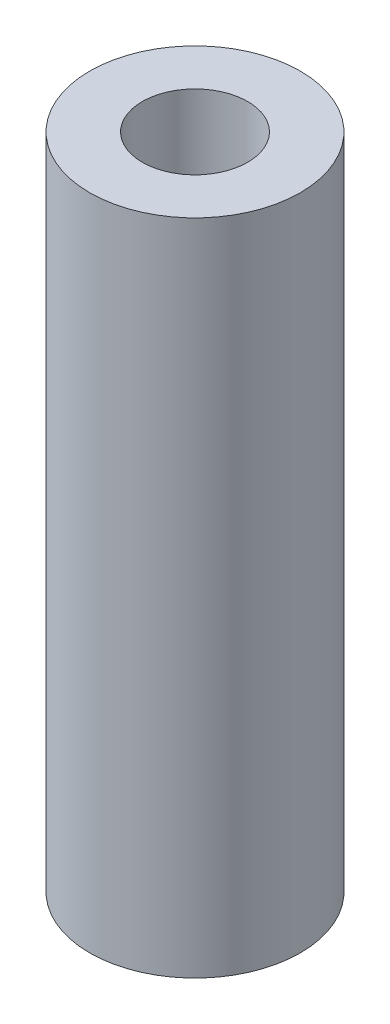
ISO-10303-21;
HEADER;
FILE_DESCRIPTION(('STEP AP214'),'2;1');
FILE_NAME('part.step','',(''),(''),'','','');
FILE_SCHEMA(('AUTOMOTIVE_DESIGN { 1 0 10303 214 1 1 1 1 }'));
ENDSEC;
DATA;
#1=APPLICATION_CONTEXT('core data for automotive mechanical design processes');
#2=APPLICATION_PROTOCOL_DEFINITION('international standard','automotive_design',2000,#1);
#3=PRODUCT_CONTEXT('',#1,'mechanical');
#4=PRODUCT('Part','Part','',(#3));
#5=PRODUCT_RELATED_PRODUCT_CATEGORY('part','',(#4));
#6=PRODUCT_DEFINITION_FORMATION('','',#4);
#7=PRODUCT_DEFINITION_CONTEXT('part definition',#1,'design');
#8=PRODUCT_DEFINITION('design','',#6,#7);
#9=PRODUCT_DEFINITION_SHAPE('','',#8);
#10=(LENGTH_UNIT() NAMED_UNIT(*) SI_UNIT(.MILLI.,.METRE.));
#11=(NAMED_UNIT(*) PLANE_ANGLE_UNIT() SI_UNIT($,.RADIAN.));
#12=(NAMED_UNIT(*) SI_UNIT($,.STERADIAN.) SOLID_ANGLE_UNIT());
#13=UNCERTAINTY_MEASURE_WITH_UNIT(LENGTH_MEASURE(1.E-05),#10,'distance_accuracy_value','');
#14=(GEOMETRIC_REPRESENTATION_CONTEXT(3) GLOBAL_UNCERTAINTY_ASSIGNED_CONTEXT((#13)) GLOBAL_UNIT_ASSIGNED_CONTEXT((#10,
#11,#12)) REPRESENTATION_CONTEXT('',''));
#15=CARTESIAN_POINT('',(0.,0.,0.));
#16=DIRECTION('',(0.,0.,1.));
#17=DIRECTION('',(1.,0.,0.));
#18=AXIS2_PLACEMENT_3D('',#15,#16,#17);
#19=CARTESIAN_POINT('',(0.,25.,0.));
#20=DIRECTION('',(0.,1.,0.));
#21=DIRECTION('',(0.,0.,1.));
#22=AXIS2_PLACEMENT_3D('',#19,#20,#21);
#23=PLANE('',#22);
#24=CARTESIAN_POINT('',(0.,25.,0.));
#25=DIRECTION('',(0.,1.,0.));
#26=DIRECTION('',(0.,0.,1.));
#27=AXIS2_PLACEMENT_3D('',#24,#25,#26);
#28=CIRCLE('',#27,4.);
#29=CARTESIAN_POINT('',(0.,25.,4.));
#30=VERTEX_POINT('',#29);
#31=EDGE_CURVE('E10',#30,#30,#28,.T.);
#32=ORIENTED_EDGE('',*,*,#31,.T.);
#33=EDGE_LOOP('',(#32));
#34=FACE_BOUND('',#33,.T.);
#35=CARTESIAN_POINT('',(0.,25.,0.));
#36=DIRECTION('',(0.,1.,0.));
#37=DIRECTION('',(0.,0.,1.));
#38=AXIS2_PLACEMENT_3D('',#35,#36,#37);
#39=CIRCLE('',#38,2.);
#40=CARTESIAN_POINT('',(0.,25.,2.));
#41=VERTEX_POINT('',#40);
#42=EDGE_CURVE('E56',#41,#41,#39,.T.);
#43=ORIENTED_EDGE('',*,*,#42,.F.);
#44=EDGE_LOOP('',(#43));
#45=FACE_BOUND('',#44,.T.);
#46=ADVANCED_FACE('F43',(#34,#45),#23,.T.);
#47=CARTESIAN_POINT('',(0.,0.,0.));
#48=DIRECTION('',(0.,1.,0.));
#49=DIRECTION('',(0.,0.,1.));
#50=AXIS2_PLACEMENT_3D('',#47,#48,#49);
#51=PLANE('',#50);
#52=CARTESIAN_POINT('',(0.,0.,0.));
#53=DIRECTION('',(0.,1.,0.));
#54=DIRECTION('',(0.,0.,1.));
#55=AXIS2_PLACEMENT_3D('',#52,#53,#54);
#56=CIRCLE('',#55,4.);
#57=CARTESIAN_POINT('',(0.,0.,4.));
#58=VERTEX_POINT('',#57);
#59=EDGE_CURVE('E47',#58,#58,#56,.T.);
#60=ORIENTED_EDGE('',*,*,#59,.F.);
#61=EDGE_LOOP('',(#60));
#62=FACE_BOUND('',#61,.T.);
#63=CARTESIAN_POINT('',(0.,0.,0.));
#64=DIRECTION('',(0.,1.,0.));
#65=DIRECTION('',(0.,0.,1.));
#66=AXIS2_PLACEMENT_3D('',#63,#64,#65);
#67=CIRCLE('',#66,2.);
#68=CARTESIAN_POINT('',(0.,0.,2.));
#69=VERTEX_POINT('',#68);
#70=EDGE_CURVE('E58',#69,#69,#67,.T.);
#71=ORIENTED_EDGE('',*,*,#70,.T.);
#72=EDGE_LOOP('',(#71));
#73=FACE_BOUND('',#72,.T.);
#74=ADVANCED_FACE('F70',(#62,#73),#51,.F.);
#75=CARTESIAN_POINT('',(0.,25.,0.));
#76=DIRECTION('',(0.,-1.,0.));
#77=DIRECTION('',(0.,0.,-1.));
#78=AXIS2_PLACEMENT_3D('',#75,#76,#77);
#79=CYLINDRICAL_SURFACE('',#78,4.);
#80=ORIENTED_EDGE('',*,*,#31,.F.);
#81=EDGE_LOOP('',(#80));
#82=FACE_BOUND('',#81,.T.);
#83=ORIENTED_EDGE('',*,*,#59,.T.);
#84=EDGE_LOOP('',(#83));
#85=FACE_BOUND('',#84,.T.);
#86=ADVANCED_FACE('F45',(#82,#85),#79,.T.);
#87=CARTESIAN_POINT('',(0.,25.,0.));
#88=DIRECTION('',(0.,-1.,0.));
#89=DIRECTION('',(0.,0.,-1.));
#90=AXIS2_PLACEMENT_3D('',#87,#88,#89);
#91=CYLINDRICAL_SURFACE('',#90,2.);
#92=ORIENTED_EDGE('',*,*,#42,.T.);
#93=EDGE_LOOP('',(#92));
#94=FACE_BOUND('',#93,.T.);
#95=ORIENTED_EDGE('',*,*,#70,.F.);
#96=EDGE_LOOP('',(#95));
#97=FACE_BOUND('',#96,.T.);
#98=ADVANCED_FACE('F66',(#94,#97),#91,.F.);
#99=CLOSED_SHELL('',(#46,#74,#86,#98));
#100=MANIFOLD_SOLID_BREP('B2',#99);
#101=ADVANCED_BREP_SHAPE_REPRESENTATION('',(#18,#100),#14);
#102=SHAPE_DEFINITION_REPRESENTATION(#9,#101);
ENDSEC;
END-ISO-10303-21;
